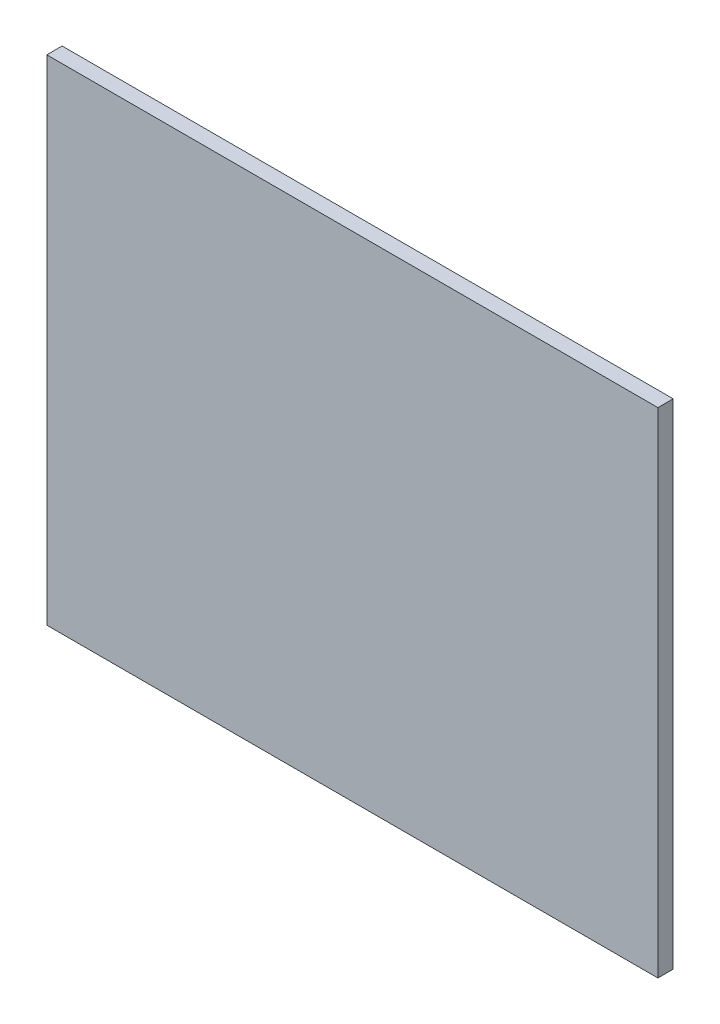
ISO-10303-21;
HEADER;
FILE_DESCRIPTION(('STEP AP214'),'2;1');
FILE_NAME('part.step','',(''),(''),'','','');
FILE_SCHEMA(('AUTOMOTIVE_DESIGN { 1 0 10303 214 1 1 1 1 }'));
ENDSEC;
DATA;
#1=APPLICATION_CONTEXT('core data for automotive mechanical design processes');
#2=APPLICATION_PROTOCOL_DEFINITION('international standard','automotive_design',2000,#1);
#3=PRODUCT_CONTEXT('',#1,'mechanical');
#4=PRODUCT('Part','Part','',(#3));
#5=PRODUCT_RELATED_PRODUCT_CATEGORY('part','',(#4));
#6=PRODUCT_DEFINITION_FORMATION('','',#4);
#7=PRODUCT_DEFINITION_CONTEXT('part definition',#1,'design');
#8=PRODUCT_DEFINITION('design','',#6,#7);
#9=PRODUCT_DEFINITION_SHAPE('','',#8);
#10=(LENGTH_UNIT() NAMED_UNIT(*) SI_UNIT(.MILLI.,.METRE.));
#11=(NAMED_UNIT(*) PLANE_ANGLE_UNIT() SI_UNIT($,.RADIAN.));
#12=(NAMED_UNIT(*) SI_UNIT($,.STERADIAN.) SOLID_ANGLE_UNIT());
#13=UNCERTAINTY_MEASURE_WITH_UNIT(LENGTH_MEASURE(1.E-05),#10,'distance_accuracy_value','');
#14=(GEOMETRIC_REPRESENTATION_CONTEXT(3) GLOBAL_UNCERTAINTY_ASSIGNED_CONTEXT((#13)) GLOBAL_UNIT_ASSIGNED_CONTEXT((#10,
#11,#12)) REPRESENTATION_CONTEXT('',''));
#15=CARTESIAN_POINT('',(0.,0.,0.));
#16=DIRECTION('',(0.,0.,1.));
#17=DIRECTION('',(1.,0.,0.));
#18=AXIS2_PLACEMENT_3D('',#15,#16,#17);
#19=CARTESIAN_POINT('',(-60.,-48.5,3.));
#20=DIRECTION('',(1.,0.,0.));
#21=DIRECTION('',(0.,0.,-1.));
#22=AXIS2_PLACEMENT_3D('',#19,#20,#21);
#23=PLANE('',#22);
#24=DIRECTION('',(0.,-1.,0.));
#25=VECTOR('',#24,1.);
#26=CARTESIAN_POINT('',(-60.,-48.5,0.));
#27=LINE('',#26,#25);
#28=CARTESIAN_POINT('',(-60.,48.5,0.));
#29=VERTEX_POINT('',#28);
#30=CARTESIAN_POINT('',(-60.,-48.5,0.));
#31=VERTEX_POINT('',#30);
#32=EDGE_CURVE('E99',#29,#31,#27,.T.);
#33=ORIENTED_EDGE('',*,*,#32,.T.);
#34=DIRECTION('',(0.,0.,-1.));
#35=VECTOR('',#34,1.);
#36=CARTESIAN_POINT('',(-60.,-48.5,3.));
#37=LINE('',#36,#35);
#38=CARTESIAN_POINT('',(-60.,-48.5,3.));
#39=VERTEX_POINT('',#38);
#40=EDGE_CURVE('E11',#39,#31,#37,.T.);
#41=ORIENTED_EDGE('',*,*,#40,.F.);
#42=DIRECTION('',(0.,-1.,0.));
#43=VECTOR('',#42,1.);
#44=CARTESIAN_POINT('',(-60.,-48.5,3.));
#45=LINE('',#44,#43);
#46=CARTESIAN_POINT('',(-60.,48.5,3.));
#47=VERTEX_POINT('',#46);
#48=EDGE_CURVE('E87',#47,#39,#45,.T.);
#49=ORIENTED_EDGE('',*,*,#48,.F.);
#50=DIRECTION('',(0.,0.,-1.));
#51=VECTOR('',#50,1.);
#52=CARTESIAN_POINT('',(-60.,48.5,3.));
#53=LINE('',#52,#51);
#54=EDGE_CURVE('E95',#47,#29,#53,.T.);
#55=ORIENTED_EDGE('',*,*,#54,.T.);
#56=EDGE_LOOP('',(#33,#41,#49,#55));
#57=FACE_BOUND('',#56,.T.);
#58=ADVANCED_FACE('F36',(#57),#23,.F.);
#59=CARTESIAN_POINT('',(60.,-48.5,3.));
#60=DIRECTION('',(0.,1.,0.));
#61=DIRECTION('',(-1.,0.,0.));
#62=AXIS2_PLACEMENT_3D('',#59,#60,#61);
#63=PLANE('',#62);
#64=DIRECTION('',(1.,0.,0.));
#65=VECTOR('',#64,1.);
#66=CARTESIAN_POINT('',(60.,-48.5,0.));
#67=LINE('',#66,#65);
#68=CARTESIAN_POINT('',(60.,-48.5,0.));
#69=VERTEX_POINT('',#68);
#70=EDGE_CURVE('E91',#31,#69,#67,.T.);
#71=ORIENTED_EDGE('',*,*,#70,.T.);
#72=DIRECTION('',(0.,0.,-1.));
#73=VECTOR('',#72,1.);
#74=CARTESIAN_POINT('',(60.,-48.5,3.));
#75=LINE('',#74,#73);
#76=CARTESIAN_POINT('',(60.,-48.5,3.));
#77=VERTEX_POINT('',#76);
#78=EDGE_CURVE('E44',#77,#69,#75,.T.);
#79=ORIENTED_EDGE('',*,*,#78,.F.);
#80=DIRECTION('',(1.,0.,0.));
#81=VECTOR('',#80,1.);
#82=CARTESIAN_POINT('',(60.,-48.5,3.));
#83=LINE('',#82,#81);
#84=EDGE_CURVE('E82',#39,#77,#83,.T.);
#85=ORIENTED_EDGE('',*,*,#84,.F.);
#86=ORIENTED_EDGE('',*,*,#40,.T.);
#87=EDGE_LOOP('',(#71,#79,#85,#86));
#88=FACE_BOUND('',#87,.T.);
#89=ADVANCED_FACE('F90',(#88),#63,.F.);
#90=CARTESIAN_POINT('',(60.,-48.5,3.));
#91=DIRECTION('',(-1.,0.,0.));
#92=DIRECTION('',(0.,0.,1.));
#93=AXIS2_PLACEMENT_3D('',#90,#91,#92);
#94=PLANE('',#93);
#95=DIRECTION('',(0.,1.,0.));
#96=VECTOR('',#95,1.);
#97=CARTESIAN_POINT('',(60.,-48.5,0.));
#98=LINE('',#97,#96);
#99=CARTESIAN_POINT('',(60.,48.5,0.));
#100=VERTEX_POINT('',#99);
#101=EDGE_CURVE('E69',#69,#100,#98,.T.);
#102=ORIENTED_EDGE('',*,*,#101,.T.);
#103=DIRECTION('',(0.,0.,-1.));
#104=VECTOR('',#103,1.);
#105=CARTESIAN_POINT('',(60.,48.5,3.));
#106=LINE('',#105,#104);
#107=CARTESIAN_POINT('',(60.,48.5,3.));
#108=VERTEX_POINT('',#107);
#109=EDGE_CURVE('E92',#108,#100,#106,.T.);
#110=ORIENTED_EDGE('',*,*,#109,.F.);
#111=DIRECTION('',(0.,1.,0.));
#112=VECTOR('',#111,1.);
#113=CARTESIAN_POINT('',(60.,-48.5,3.));
#114=LINE('',#113,#112);
#115=EDGE_CURVE('E85',#77,#108,#114,.T.);
#116=ORIENTED_EDGE('',*,*,#115,.F.);
#117=ORIENTED_EDGE('',*,*,#78,.T.);
#118=EDGE_LOOP('',(#102,#110,#116,#117));
#119=FACE_BOUND('',#118,.T.);
#120=ADVANCED_FACE('F93',(#119),#94,.F.);
#121=CARTESIAN_POINT('',(60.,48.5,3.));
#122=DIRECTION('',(0.,-1.,0.));
#123=DIRECTION('',(1.,0.,0.));
#124=AXIS2_PLACEMENT_3D('',#121,#122,#123);
#125=PLANE('',#124);
#126=DIRECTION('',(-1.,0.,0.));
#127=VECTOR('',#126,1.);
#128=CARTESIAN_POINT('',(60.,48.5,0.));
#129=LINE('',#128,#127);
#130=EDGE_CURVE('E75',#100,#29,#129,.T.);
#131=ORIENTED_EDGE('',*,*,#130,.T.);
#132=ORIENTED_EDGE('',*,*,#54,.F.);
#133=DIRECTION('',(-1.,0.,0.));
#134=VECTOR('',#133,1.);
#135=CARTESIAN_POINT('',(60.,48.5,3.));
#136=LINE('',#135,#134);
#137=EDGE_CURVE('E52',#108,#47,#136,.T.);
#138=ORIENTED_EDGE('',*,*,#137,.F.);
#139=ORIENTED_EDGE('',*,*,#109,.T.);
#140=EDGE_LOOP('',(#131,#132,#138,#139));
#141=FACE_BOUND('',#140,.T.);
#142=ADVANCED_FACE('F106',(#141),#125,.F.);
#143=CARTESIAN_POINT('',(0.,0.,3.));
#144=DIRECTION('',(0.,0.,1.));
#145=DIRECTION('',(1.,0.,0.));
#146=AXIS2_PLACEMENT_3D('',#143,#144,#145);
#147=PLANE('',#146);
#148=ORIENTED_EDGE('',*,*,#48,.T.);
#149=ORIENTED_EDGE('',*,*,#84,.T.);
#150=ORIENTED_EDGE('',*,*,#115,.T.);
#151=ORIENTED_EDGE('',*,*,#137,.T.);
#152=EDGE_LOOP('',(#148,#149,#150,#151));
#153=FACE_BOUND('',#152,.T.);
#154=ADVANCED_FACE('F83',(#153),#147,.T.);
#155=CARTESIAN_POINT('',(0.,0.,0.));
#156=DIRECTION('',(0.,0.,1.));
#157=DIRECTION('',(1.,0.,0.));
#158=AXIS2_PLACEMENT_3D('',#155,#156,#157);
#159=PLANE('',#158);
#160=ORIENTED_EDGE('',*,*,#32,.F.);
#161=ORIENTED_EDGE('',*,*,#130,.F.);
#162=ORIENTED_EDGE('',*,*,#101,.F.);
#163=ORIENTED_EDGE('',*,*,#70,.F.);
#164=EDGE_LOOP('',(#160,#161,#162,#163));
#165=FACE_BOUND('',#164,.T.);
#166=ADVANCED_FACE('F109',(#165),#159,.F.);
#167=CLOSED_SHELL('',(#58,#89,#120,#142,#154,#166));
#168=MANIFOLD_SOLID_BREP('B2',#167);
#169=ADVANCED_BREP_SHAPE_REPRESENTATION('',(#18,#168),#14);
#170=SHAPE_DEFINITION_REPRESENTATION(#9,#169);
ENDSEC;
END-ISO-10303-21;
